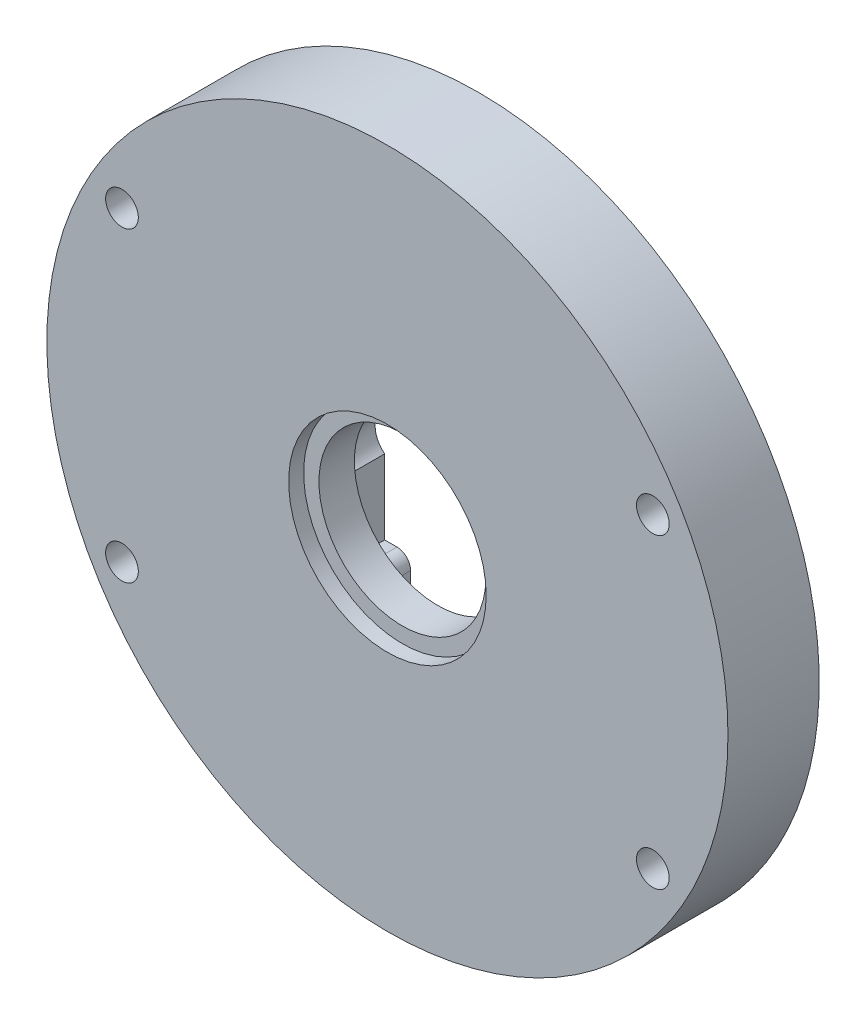
ISO-10303-21;
HEADER;
FILE_DESCRIPTION(('STEP AP214'),'2;1');
FILE_NAME('part.step','',(''),(''),'','','');
FILE_SCHEMA(('AUTOMOTIVE_DESIGN { 1 0 10303 214 1 1 1 1 }'));
ENDSEC;
DATA;
#1=APPLICATION_CONTEXT('core data for automotive mechanical design processes');
#2=APPLICATION_PROTOCOL_DEFINITION('international standard','automotive_design',2000,#1);
#3=PRODUCT_CONTEXT('',#1,'mechanical');
#4=PRODUCT('Part','Part','',(#3));
#5=PRODUCT_RELATED_PRODUCT_CATEGORY('part','',(#4));
#6=PRODUCT_DEFINITION_FORMATION('','',#4);
#7=PRODUCT_DEFINITION_CONTEXT('part definition',#1,'design');
#8=PRODUCT_DEFINITION('design','',#6,#7);
#9=PRODUCT_DEFINITION_SHAPE('','',#8);
#10=(LENGTH_UNIT() NAMED_UNIT(*) SI_UNIT(.MILLI.,.METRE.));
#11=(NAMED_UNIT(*) PLANE_ANGLE_UNIT() SI_UNIT($,.RADIAN.));
#12=(NAMED_UNIT(*) SI_UNIT($,.STERADIAN.) SOLID_ANGLE_UNIT());
#13=UNCERTAINTY_MEASURE_WITH_UNIT(LENGTH_MEASURE(1.E-05),#10,'distance_accuracy_value','');
#14=(GEOMETRIC_REPRESENTATION_CONTEXT(3) GLOBAL_UNCERTAINTY_ASSIGNED_CONTEXT((#13)) GLOBAL_UNIT_ASSIGNED_CONTEXT((#10,
#11,#12)) REPRESENTATION_CONTEXT('',''));
#15=CARTESIAN_POINT('',(0.,0.,0.));
#16=DIRECTION('',(0.,0.,1.));
#17=DIRECTION('',(1.,0.,0.));
#18=AXIS2_PLACEMENT_3D('',#15,#16,#17);
#19=CARTESIAN_POINT('',(0.,0.,5.6));
#20=DIRECTION('',(0.,0.,1.));
#21=DIRECTION('',(1.,0.,0.));
#22=AXIS2_PLACEMENT_3D('',#19,#20,#21);
#23=PLANE('',#22);
#24=CARTESIAN_POINT('',(0.,0.,5.6));
#25=DIRECTION('',(0.,0.,1.));
#26=DIRECTION('',(1.,0.,0.));
#27=AXIS2_PLACEMENT_3D('',#24,#25,#26);
#28=CIRCLE('',#27,6.125);
#29=CARTESIAN_POINT('',(6.125,0.,5.6));
#30=VERTEX_POINT('',#29);
#31=EDGE_CURVE('E339',#30,#30,#28,.T.);
#32=ORIENTED_EDGE('',*,*,#31,.F.);
#33=EDGE_LOOP('',(#32));
#34=FACE_BOUND('',#33,.T.);
#35=CARTESIAN_POINT('',(0.,0.,5.6));
#36=DIRECTION('',(0.,0.,1.));
#37=DIRECTION('',(1.,0.,0.));
#38=AXIS2_PLACEMENT_3D('',#35,#36,#37);
#39=CIRCLE('',#38,7.25);
#40=CARTESIAN_POINT('',(7.25,0.,5.6));
#41=VERTEX_POINT('',#40);
#42=EDGE_CURVE('E222',#41,#41,#39,.F.);
#43=ORIENTED_EDGE('',*,*,#42,.F.);
#44=EDGE_LOOP('',(#43));
#45=FACE_BOUND('',#44,.T.);
#46=ADVANCED_FACE('F37',(#34,#45),#23,.T.);
#47=CARTESIAN_POINT('',(6.90000000000001,-6.9,3.));
#48=DIRECTION('',(1.,0.,0.));
#49=DIRECTION('',(0.,1.,0.));
#50=AXIS2_PLACEMENT_3D('',#47,#48,#49);
#51=PLANE('',#50);
#52=DIRECTION('',(0.,-1.,0.));
#53=VECTOR('',#52,1.);
#54=CARTESIAN_POINT('',(6.90000000000001,-6.9,0.));
#55=LINE('',#54,#53);
#56=CARTESIAN_POINT('',(6.9,6.9,0.));
#57=VERTEX_POINT('',#56);
#58=CARTESIAN_POINT('',(6.9,1.4247806848775,0.));
#59=VERTEX_POINT('',#58);
#60=EDGE_CURVE('E145',#57,#59,#55,.T.);
#61=ORIENTED_EDGE('',*,*,#60,.T.);
#62=DIRECTION('',(0.,0.,1.));
#63=VECTOR('',#62,1.);
#64=CARTESIAN_POINT('',(6.9,1.4247806848775,0.));
#65=LINE('',#64,#63);
#66=CARTESIAN_POINT('',(6.9,1.4247806848775,3.));
#67=VERTEX_POINT('',#66);
#68=EDGE_CURVE('E137',#59,#67,#65,.T.);
#69=ORIENTED_EDGE('',*,*,#68,.T.);
#70=DIRECTION('',(0.,-1.,0.));
#71=VECTOR('',#70,1.);
#72=CARTESIAN_POINT('',(6.90000000000001,-6.9,3.));
#73=LINE('',#72,#71);
#74=CARTESIAN_POINT('',(6.9,6.9,3.));
#75=VERTEX_POINT('',#74);
#76=EDGE_CURVE('E142',#75,#67,#73,.T.);
#77=ORIENTED_EDGE('',*,*,#76,.F.);
#78=DIRECTION('',(0.,0.,-1.));
#79=VECTOR('',#78,1.);
#80=CARTESIAN_POINT('',(6.9,6.9,3.));
#81=LINE('',#80,#79);
#82=EDGE_CURVE('E183',#75,#57,#81,.T.);
#83=ORIENTED_EDGE('',*,*,#82,.T.);
#84=EDGE_LOOP('',(#61,#69,#77,#83));
#85=FACE_BOUND('',#84,.T.);
#86=ADVANCED_FACE('F139',(#85),#51,.F.);
#87=CARTESIAN_POINT('',(-6.9,-6.9,3.));
#88=DIRECTION('',(-1.,0.,0.));
#89=DIRECTION('',(0.,0.,1.));
#90=AXIS2_PLACEMENT_3D('',#87,#88,#89);
#91=PLANE('',#90);
#92=DIRECTION('',(0.,1.,0.));
#93=VECTOR('',#92,1.);
#94=CARTESIAN_POINT('',(-6.9,-6.9,0.));
#95=LINE('',#94,#93);
#96=CARTESIAN_POINT('',(-6.9,-6.9,0.));
#97=VERTEX_POINT('',#96);
#98=CARTESIAN_POINT('',(-6.9,-1.4247806848775,0.));
#99=VERTEX_POINT('',#98);
#100=EDGE_CURVE('E197',#97,#99,#95,.T.);
#101=ORIENTED_EDGE('',*,*,#100,.T.);
#102=DIRECTION('',(0.,0.,1.));
#103=VECTOR('',#102,1.);
#104=CARTESIAN_POINT('',(-6.9,-1.4247806848775,0.));
#105=LINE('',#104,#103);
#106=CARTESIAN_POINT('',(-6.9,-1.4247806848775,3.));
#107=VERTEX_POINT('',#106);
#108=EDGE_CURVE('E332',#99,#107,#105,.T.);
#109=ORIENTED_EDGE('',*,*,#108,.T.);
#110=DIRECTION('',(0.,1.,0.));
#111=VECTOR('',#110,1.);
#112=CARTESIAN_POINT('',(-6.9,-6.9,3.));
#113=LINE('',#112,#111);
#114=CARTESIAN_POINT('',(-6.9,-6.9,3.));
#115=VERTEX_POINT('',#114);
#116=EDGE_CURVE('E179',#115,#107,#113,.T.);
#117=ORIENTED_EDGE('',*,*,#116,.F.);
#118=DIRECTION('',(0.,0.,-1.));
#119=VECTOR('',#118,1.);
#120=CARTESIAN_POINT('',(-6.9,-6.9,3.));
#121=LINE('',#120,#119);
#122=EDGE_CURVE('E205',#115,#97,#121,.T.);
#123=ORIENTED_EDGE('',*,*,#122,.T.);
#124=EDGE_LOOP('',(#101,#109,#117,#123));
#125=FACE_BOUND('',#124,.T.);
#126=ADVANCED_FACE('F279',(#125),#91,.F.);
#127=CARTESIAN_POINT('',(6.90000000000001,-1.42478068487749,3.));
#128=VERTEX_POINT('',#127);
#129=CARTESIAN_POINT('',(6.90000000000001,-6.9,3.));
#130=VERTEX_POINT('',#129);
#131=EDGE_CURVE('E165',#128,#130,#73,.T.);
#132=ORIENTED_EDGE('',*,*,#131,.F.);
#133=DIRECTION('',(0.,0.,1.));
#134=VECTOR('',#133,1.);
#135=CARTESIAN_POINT('',(6.90000000000001,-1.42478068487749,0.));
#136=LINE('',#135,#134);
#137=CARTESIAN_POINT('',(6.90000000000001,-1.42478068487749,0.));
#138=VERTEX_POINT('',#137);
#139=EDGE_CURVE('E149',#128,#138,#136,.F.);
#140=ORIENTED_EDGE('',*,*,#139,.T.);
#141=CARTESIAN_POINT('',(6.90000000000001,-6.9,0.));
#142=VERTEX_POINT('',#141);
#143=EDGE_CURVE('E148',#138,#142,#55,.T.);
#144=ORIENTED_EDGE('',*,*,#143,.T.);
#145=DIRECTION('',(0.,0.,-1.));
#146=VECTOR('',#145,1.);
#147=CARTESIAN_POINT('',(6.90000000000001,-6.9,3.));
#148=LINE('',#147,#146);
#149=EDGE_CURVE('E214',#130,#142,#148,.T.);
#150=ORIENTED_EDGE('',*,*,#149,.F.);
#151=EDGE_LOOP('',(#132,#140,#144,#150));
#152=FACE_BOUND('',#151,.T.);
#153=ADVANCED_FACE('F281',(#152),#51,.F.);
#154=CARTESIAN_POINT('',(6.90000000000001,-6.9,3.));
#155=DIRECTION('',(0.,-1.,0.));
#156=DIRECTION('',(1.,0.,0.));
#157=AXIS2_PLACEMENT_3D('',#154,#155,#156);
#158=PLANE('',#157);
#159=DIRECTION('',(-1.,0.,0.));
#160=VECTOR('',#159,1.);
#161=CARTESIAN_POINT('',(6.90000000000001,-6.9,0.));
#162=LINE('',#161,#160);
#163=CARTESIAN_POINT('',(6.,-6.9,0.));
#164=VERTEX_POINT('',#163);
#165=EDGE_CURVE('E185',#142,#164,#162,.T.);
#166=ORIENTED_EDGE('',*,*,#165,.T.);
#167=DIRECTION('',(0.,0.,-1.));
#168=VECTOR('',#167,1.);
#169=CARTESIAN_POINT('',(6.,-6.9,3.));
#170=LINE('',#169,#168);
#171=CARTESIAN_POINT('',(6.,-6.9,3.));
#172=VERTEX_POINT('',#171);
#173=EDGE_CURVE('E52',#164,#172,#170,.F.);
#174=ORIENTED_EDGE('',*,*,#173,.T.);
#175=DIRECTION('',(-1.,0.,0.));
#176=VECTOR('',#175,1.);
#177=CARTESIAN_POINT('',(6.90000000000001,-6.9,3.));
#178=LINE('',#177,#176);
#179=EDGE_CURVE('E164',#130,#172,#178,.T.);
#180=ORIENTED_EDGE('',*,*,#179,.F.);
#181=ORIENTED_EDGE('',*,*,#149,.T.);
#182=EDGE_LOOP('',(#166,#174,#180,#181));
#183=FACE_BOUND('',#182,.T.);
#184=ADVANCED_FACE('F316',(#183),#158,.F.);
#185=CARTESIAN_POINT('',(5.,-6.9,3.));
#186=DIRECTION('',(1.,0.,0.));
#187=DIRECTION('',(0.,1.,0.));
#188=AXIS2_PLACEMENT_3D('',#185,#186,#187);
#189=PLANE('',#188);
#190=DIRECTION('',(0.,-1.,0.));
#191=VECTOR('',#190,1.);
#192=CARTESIAN_POINT('',(5.,-6.9,3.));
#193=LINE('',#192,#191);
#194=CARTESIAN_POINT('',(5.,-7.9,3.));
#195=VERTEX_POINT('',#194);
#196=CARTESIAN_POINT('',(5.,-24.4948974278318,3.));
#197=VERTEX_POINT('',#196);
#198=EDGE_CURVE('E167',#195,#197,#193,.T.);
#199=ORIENTED_EDGE('',*,*,#198,.F.);
#200=DIRECTION('',(0.,0.,-1.));
#201=VECTOR('',#200,1.);
#202=CARTESIAN_POINT('',(5.,-7.9,3.));
#203=LINE('',#202,#201);
#204=CARTESIAN_POINT('',(5.,-7.9,0.));
#205=VERTEX_POINT('',#204);
#206=EDGE_CURVE('E234',#195,#205,#203,.T.);
#207=ORIENTED_EDGE('',*,*,#206,.T.);
#208=DIRECTION('',(0.,-1.,0.));
#209=VECTOR('',#208,1.);
#210=CARTESIAN_POINT('',(5.,-6.9,0.));
#211=LINE('',#210,#209);
#212=CARTESIAN_POINT('',(5.,-24.4948974278318,0.));
#213=VERTEX_POINT('',#212);
#214=EDGE_CURVE('E187',#205,#213,#211,.T.);
#215=ORIENTED_EDGE('',*,*,#214,.T.);
#216=DIRECTION('',(0.,0.,-1.));
#217=VECTOR('',#216,1.);
#218=CARTESIAN_POINT('',(5.,-24.4948974278318,3.));
#219=LINE('',#218,#217);
#220=EDGE_CURVE('E211',#197,#213,#219,.T.);
#221=ORIENTED_EDGE('',*,*,#220,.F.);
#222=EDGE_LOOP('',(#199,#207,#215,#221));
#223=FACE_BOUND('',#222,.T.);
#224=ADVANCED_FACE('F265',(#223),#189,.F.);
#225=CARTESIAN_POINT('',(0.,0.,3.));
#226=DIRECTION('',(0.,0.,-1.));
#227=DIRECTION('',(-1.,0.,0.));
#228=AXIS2_PLACEMENT_3D('',#225,#226,#227);
#229=CYLINDRICAL_SURFACE('',#228,25.);
#230=CARTESIAN_POINT('',(0.,0.,0.));
#231=DIRECTION('',(0.,0.,1.));
#232=DIRECTION('',(1.,0.,0.));
#233=AXIS2_PLACEMENT_3D('',#230,#231,#232);
#234=CIRCLE('',#233,25.);
#235=CARTESIAN_POINT('',(-5.00000000000001,-24.4948974278318,0.));
#236=VERTEX_POINT('',#235);
#237=EDGE_CURVE('E189',#213,#236,#234,.T.);
#238=ORIENTED_EDGE('',*,*,#237,.T.);
#239=DIRECTION('',(0.,0.,-1.));
#240=VECTOR('',#239,1.);
#241=CARTESIAN_POINT('',(-5.00000000000001,-24.4948974278318,3.));
#242=LINE('',#241,#240);
#243=CARTESIAN_POINT('',(-5.00000000000001,-24.4948974278318,3.));
#244=VERTEX_POINT('',#243);
#245=EDGE_CURVE('E208',#244,#236,#242,.T.);
#246=ORIENTED_EDGE('',*,*,#245,.F.);
#247=CARTESIAN_POINT('',(0.,0.,3.));
#248=DIRECTION('',(0.,0.,1.));
#249=DIRECTION('',(1.,0.,0.));
#250=AXIS2_PLACEMENT_3D('',#247,#248,#249);
#251=CIRCLE('',#250,25.);
#252=EDGE_CURVE('E158',#244,#197,#251,.T.);
#253=ORIENTED_EDGE('',*,*,#252,.T.);
#254=ORIENTED_EDGE('',*,*,#220,.T.);
#255=EDGE_LOOP('',(#238,#246,#253,#254));
#256=FACE_BOUND('',#255,.T.);
#257=CARTESIAN_POINT('',(0.,0.,6.7));
#258=DIRECTION('',(0.,0.,1.));
#259=DIRECTION('',(1.,0.,0.));
#260=AXIS2_PLACEMENT_3D('',#257,#258,#259);
#261=CIRCLE('',#260,25.);
#262=CARTESIAN_POINT('',(25.,0.,6.7));
#263=VERTEX_POINT('',#262);
#264=EDGE_CURVE('E343',#263,#263,#261,.T.);
#265=ORIENTED_EDGE('',*,*,#264,.F.);
#266=EDGE_LOOP('',(#265));
#267=FACE_BOUND('',#266,.T.);
#268=ADVANCED_FACE('F259',(#256,#267),#229,.T.);
#269=CARTESIAN_POINT('',(-5.,-6.9,3.));
#270=DIRECTION('',(-1.,0.,0.));
#271=DIRECTION('',(0.,-1.,0.));
#272=AXIS2_PLACEMENT_3D('',#269,#270,#271);
#273=PLANE('',#272);
#274=DIRECTION('',(0.,1.,0.));
#275=VECTOR('',#274,1.);
#276=CARTESIAN_POINT('',(-5.,-6.9,0.));
#277=LINE('',#276,#275);
#278=CARTESIAN_POINT('',(-5.,-7.9,0.));
#279=VERTEX_POINT('',#278);
#280=EDGE_CURVE('E191',#236,#279,#277,.T.);
#281=ORIENTED_EDGE('',*,*,#280,.T.);
#282=DIRECTION('',(0.,0.,-1.));
#283=VECTOR('',#282,1.);
#284=CARTESIAN_POINT('',(-5.,-7.9,3.));
#285=LINE('',#284,#283);
#286=CARTESIAN_POINT('',(-5.,-7.9,3.));
#287=VERTEX_POINT('',#286);
#288=EDGE_CURVE('E232',#279,#287,#285,.F.);
#289=ORIENTED_EDGE('',*,*,#288,.T.);
#290=DIRECTION('',(0.,1.,0.));
#291=VECTOR('',#290,1.);
#292=CARTESIAN_POINT('',(-5.,-6.9,3.));
#293=LINE('',#292,#291);
#294=EDGE_CURVE('E173',#244,#287,#293,.T.);
#295=ORIENTED_EDGE('',*,*,#294,.F.);
#296=ORIENTED_EDGE('',*,*,#245,.T.);
#297=EDGE_LOOP('',(#281,#289,#295,#296));
#298=FACE_BOUND('',#297,.T.);
#299=ADVANCED_FACE('F256',(#298),#273,.F.);
#300=CARTESIAN_POINT('',(-5.,-6.9,3.));
#301=DIRECTION('',(0.,-1.,0.));
#302=DIRECTION('',(0.,0.,-1.));
#303=AXIS2_PLACEMENT_3D('',#300,#301,#302);
#304=PLANE('',#303);
#305=DIRECTION('',(-1.,0.,0.));
#306=VECTOR('',#305,1.);
#307=CARTESIAN_POINT('',(-5.,-6.9,3.));
#308=LINE('',#307,#306);
#309=CARTESIAN_POINT('',(-6.,-6.9,3.));
#310=VERTEX_POINT('',#309);
#311=EDGE_CURVE('E176',#310,#115,#308,.T.);
#312=ORIENTED_EDGE('',*,*,#311,.F.);
#313=DIRECTION('',(0.,0.,-1.));
#314=VECTOR('',#313,1.);
#315=CARTESIAN_POINT('',(-6.,-6.9,3.));
#316=LINE('',#315,#314);
#317=CARTESIAN_POINT('',(-6.,-6.9,0.));
#318=VERTEX_POINT('',#317);
#319=EDGE_CURVE('E225',#310,#318,#316,.T.);
#320=ORIENTED_EDGE('',*,*,#319,.T.);
#321=DIRECTION('',(-1.,0.,0.));
#322=VECTOR('',#321,1.);
#323=CARTESIAN_POINT('',(-5.,-6.9,0.));
#324=LINE('',#323,#322);
#325=EDGE_CURVE('E194',#318,#97,#324,.T.);
#326=ORIENTED_EDGE('',*,*,#325,.T.);
#327=ORIENTED_EDGE('',*,*,#122,.F.);
#328=EDGE_LOOP('',(#312,#320,#326,#327));
#329=FACE_BOUND('',#328,.T.);
#330=ADVANCED_FACE('F246',(#329),#304,.F.);
#331=CARTESIAN_POINT('',(-6.9,1.4247806848775,3.));
#332=VERTEX_POINT('',#331);
#333=CARTESIAN_POINT('',(-6.9,6.9,3.));
#334=VERTEX_POINT('',#333);
#335=EDGE_CURVE('E178',#332,#334,#113,.T.);
#336=ORIENTED_EDGE('',*,*,#335,.F.);
#337=DIRECTION('',(0.,0.,1.));
#338=VECTOR('',#337,1.);
#339=CARTESIAN_POINT('',(-6.9,1.4247806848775,0.));
#340=LINE('',#339,#338);
#341=CARTESIAN_POINT('',(-6.9,1.4247806848775,0.));
#342=VERTEX_POINT('',#341);
#343=EDGE_CURVE('E331',#332,#342,#340,.F.);
#344=ORIENTED_EDGE('',*,*,#343,.T.);
#345=CARTESIAN_POINT('',(-6.9,6.9,0.));
#346=VERTEX_POINT('',#345);
#347=EDGE_CURVE('E196',#342,#346,#95,.T.);
#348=ORIENTED_EDGE('',*,*,#347,.T.);
#349=DIRECTION('',(0.,0.,-1.));
#350=VECTOR('',#349,1.);
#351=CARTESIAN_POINT('',(-6.9,6.9,3.));
#352=LINE('',#351,#350);
#353=EDGE_CURVE('E202',#334,#346,#352,.T.);
#354=ORIENTED_EDGE('',*,*,#353,.F.);
#355=EDGE_LOOP('',(#336,#344,#348,#354));
#356=FACE_BOUND('',#355,.T.);
#357=ADVANCED_FACE('F303',(#356),#91,.F.);
#358=CARTESIAN_POINT('',(6.9,6.9,3.));
#359=DIRECTION('',(0.,1.,0.));
#360=DIRECTION('',(-1.,0.,0.));
#361=AXIS2_PLACEMENT_3D('',#358,#359,#360);
#362=PLANE('',#361);
#363=DIRECTION('',(1.,0.,0.));
#364=VECTOR('',#363,1.);
#365=CARTESIAN_POINT('',(6.9,6.9,0.));
#366=LINE('',#365,#364);
#367=EDGE_CURVE('E169',#346,#57,#366,.T.);
#368=ORIENTED_EDGE('',*,*,#367,.T.);
#369=ORIENTED_EDGE('',*,*,#82,.F.);
#370=DIRECTION('',(1.,0.,0.));
#371=VECTOR('',#370,1.);
#372=CARTESIAN_POINT('',(6.9,6.9,3.));
#373=LINE('',#372,#371);
#374=EDGE_CURVE('E163',#334,#75,#373,.T.);
#375=ORIENTED_EDGE('',*,*,#374,.F.);
#376=ORIENTED_EDGE('',*,*,#353,.T.);
#377=EDGE_LOOP('',(#368,#369,#375,#376));
#378=FACE_BOUND('',#377,.T.);
#379=ADVANCED_FACE('F299',(#378),#362,.F.);
#380=CARTESIAN_POINT('',(0.,0.,0.));
#381=DIRECTION('',(0.,0.,1.));
#382=DIRECTION('',(1.,0.,0.));
#383=AXIS2_PLACEMENT_3D('',#380,#381,#382);
#384=PLANE('',#383);
#385=CARTESIAN_POINT('',(19.4855715851499,11.25,0.));
#386=DIRECTION('',(0.,0.,1.));
#387=DIRECTION('',(1.,0.,0.));
#388=AXIS2_PLACEMENT_3D('',#385,#386,#387);
#389=CIRCLE('',#388,1.2);
#390=CARTESIAN_POINT('',(20.6855715851499,11.25,0.));
#391=VERTEX_POINT('',#390);
#392=EDGE_CURVE('E355',#391,#391,#389,.T.);
#393=ORIENTED_EDGE('',*,*,#392,.T.);
#394=EDGE_LOOP('',(#393));
#395=FACE_BOUND('',#394,.T.);
#396=CARTESIAN_POINT('',(-19.4855715851499,11.25,0.));
#397=DIRECTION('',(0.,0.,1.));
#398=DIRECTION('',(-1.,0.,0.));
#399=AXIS2_PLACEMENT_3D('',#396,#397,#398);
#400=CIRCLE('',#399,1.2);
#401=CARTESIAN_POINT('',(-20.6855715851499,11.25,0.));
#402=VERTEX_POINT('',#401);
#403=EDGE_CURVE('E367',#402,#402,#400,.T.);
#404=ORIENTED_EDGE('',*,*,#403,.T.);
#405=EDGE_LOOP('',(#404));
#406=FACE_BOUND('',#405,.T.);
#407=CARTESIAN_POINT('',(-19.4855715851499,-11.25,0.));
#408=DIRECTION('',(0.,0.,1.));
#409=DIRECTION('',(-1.,0.,0.));
#410=AXIS2_PLACEMENT_3D('',#407,#408,#409);
#411=CIRCLE('',#410,1.2);
#412=CARTESIAN_POINT('',(-20.6855715851499,-11.25,0.));
#413=VERTEX_POINT('',#412);
#414=EDGE_CURVE('E361',#413,#413,#411,.T.);
#415=ORIENTED_EDGE('',*,*,#414,.T.);
#416=EDGE_LOOP('',(#415));
#417=FACE_BOUND('',#416,.T.);
#418=CARTESIAN_POINT('',(19.4855715851499,-11.25,0.));
#419=DIRECTION('',(0.,0.,1.));
#420=DIRECTION('',(1.,0.,0.));
#421=AXIS2_PLACEMENT_3D('',#418,#419,#420);
#422=CIRCLE('',#421,1.2);
#423=CARTESIAN_POINT('',(20.6855715851499,-11.25,0.));
#424=VERTEX_POINT('',#423);
#425=EDGE_CURVE('E351',#424,#424,#422,.T.);
#426=ORIENTED_EDGE('',*,*,#425,.T.);
#427=EDGE_LOOP('',(#426));
#428=FACE_BOUND('',#427,.T.);
#429=ORIENTED_EDGE('',*,*,#325,.F.);
#430=CARTESIAN_POINT('',(-6.,-7.9,0.));
#431=DIRECTION('',(0.,0.,1.));
#432=DIRECTION('',(1.,0.,0.));
#433=AXIS2_PLACEMENT_3D('',#430,#431,#432);
#434=CIRCLE('',#433,1.);
#435=EDGE_CURVE('E230',#318,#279,#434,.F.);
#436=ORIENTED_EDGE('',*,*,#435,.T.);
#437=ORIENTED_EDGE('',*,*,#280,.F.);
#438=ORIENTED_EDGE('',*,*,#237,.F.);
#439=ORIENTED_EDGE('',*,*,#214,.F.);
#440=CARTESIAN_POINT('',(6.,-7.9,0.));
#441=DIRECTION('',(0.,0.,1.));
#442=DIRECTION('',(1.,0.,0.));
#443=AXIS2_PLACEMENT_3D('',#440,#441,#442);
#444=CIRCLE('',#443,1.);
#445=EDGE_CURVE('E228',#205,#164,#444,.F.);
#446=ORIENTED_EDGE('',*,*,#445,.T.);
#447=ORIENTED_EDGE('',*,*,#165,.F.);
#448=ORIENTED_EDGE('',*,*,#143,.F.);
#449=CARTESIAN_POINT('',(5.8,0.,0.));
#450=DIRECTION('',(0.,0.,1.));
#451=DIRECTION('',(1.,0.,0.));
#452=AXIS2_PLACEMENT_3D('',#449,#450,#451);
#453=CIRCLE('',#452,1.8);
#454=EDGE_CURVE('E220',#138,#59,#453,.T.);
#455=ORIENTED_EDGE('',*,*,#454,.T.);
#456=ORIENTED_EDGE('',*,*,#60,.F.);
#457=ORIENTED_EDGE('',*,*,#367,.F.);
#458=ORIENTED_EDGE('',*,*,#347,.F.);
#459=CARTESIAN_POINT('',(-5.8,0.,0.));
#460=DIRECTION('',(0.,0.,1.));
#461=DIRECTION('',(1.,0.,0.));
#462=AXIS2_PLACEMENT_3D('',#459,#460,#461);
#463=CIRCLE('',#462,1.8);
#464=EDGE_CURVE('E217',#342,#99,#463,.T.);
#465=ORIENTED_EDGE('',*,*,#464,.T.);
#466=ORIENTED_EDGE('',*,*,#100,.F.);
#467=EDGE_LOOP('',(#429,#436,#437,#438,#439,#446,#447,#448,#455,#456,#457,#458,#465,#466));
#468=FACE_BOUND('',#467,.T.);
#469=ADVANCED_FACE('F252',(#395,#406,#417,#428,#468),#384,.F.);
#470=CARTESIAN_POINT('',(-5.8,0.,0.));
#471=DIRECTION('',(0.,0.,1.));
#472=DIRECTION('',(1.,0.,0.));
#473=AXIS2_PLACEMENT_3D('',#470,#471,#472);
#474=CYLINDRICAL_SURFACE('',#473,1.8);
#475=ORIENTED_EDGE('',*,*,#464,.F.);
#476=ORIENTED_EDGE('',*,*,#343,.F.);
#477=CARTESIAN_POINT('',(-5.8,0.,3.));
#478=DIRECTION('',(0.,0.,1.));
#479=DIRECTION('',(1.,0.,0.));
#480=AXIS2_PLACEMENT_3D('',#477,#478,#479);
#481=CIRCLE('',#480,1.8);
#482=EDGE_CURVE('E157',#332,#107,#481,.T.);
#483=ORIENTED_EDGE('',*,*,#482,.T.);
#484=ORIENTED_EDGE('',*,*,#108,.F.);
#485=EDGE_LOOP('',(#475,#476,#483,#484));
#486=FACE_BOUND('',#485,.T.);
#487=ADVANCED_FACE('F291',(#486),#474,.F.);
#488=CARTESIAN_POINT('',(5.8,0.,0.));
#489=DIRECTION('',(0.,0.,1.));
#490=DIRECTION('',(1.,0.,0.));
#491=AXIS2_PLACEMENT_3D('',#488,#489,#490);
#492=CYLINDRICAL_SURFACE('',#491,1.8);
#493=ORIENTED_EDGE('',*,*,#454,.F.);
#494=ORIENTED_EDGE('',*,*,#139,.F.);
#495=CARTESIAN_POINT('',(5.8,0.,3.));
#496=DIRECTION('',(0.,0.,1.));
#497=DIRECTION('',(1.,0.,0.));
#498=AXIS2_PLACEMENT_3D('',#495,#496,#497);
#499=CIRCLE('',#498,1.8);
#500=EDGE_CURVE('E152',#128,#67,#499,.T.);
#501=ORIENTED_EDGE('',*,*,#500,.T.);
#502=ORIENTED_EDGE('',*,*,#68,.F.);
#503=EDGE_LOOP('',(#493,#494,#501,#502));
#504=FACE_BOUND('',#503,.T.);
#505=ADVANCED_FACE('F153',(#504),#492,.F.);
#506=CARTESIAN_POINT('',(0.,0.,3.));
#507=DIRECTION('',(0.,0.,1.));
#508=DIRECTION('',(1.,0.,0.));
#509=AXIS2_PLACEMENT_3D('',#506,#507,#508);
#510=PLANE('',#509);
#511=CARTESIAN_POINT('',(0.,0.,3.));
#512=DIRECTION('',(0.,0.,1.));
#513=DIRECTION('',(1.,0.,0.));
#514=AXIS2_PLACEMENT_3D('',#511,#512,#513);
#515=CIRCLE('',#514,6.125);
#516=CARTESIAN_POINT('',(6.125,0.,3.));
#517=VERTEX_POINT('',#516);
#518=EDGE_CURVE('E340',#517,#517,#515,.T.);
#519=ORIENTED_EDGE('',*,*,#518,.T.);
#520=EDGE_LOOP('',(#519));
#521=FACE_BOUND('',#520,.T.);
#522=ORIENTED_EDGE('',*,*,#179,.T.);
#523=CARTESIAN_POINT('',(6.,-7.9,3.));
#524=DIRECTION('',(0.,0.,1.));
#525=DIRECTION('',(1.,0.,0.));
#526=AXIS2_PLACEMENT_3D('',#523,#524,#525);
#527=CIRCLE('',#526,1.);
#528=EDGE_CURVE('E11',#172,#195,#527,.T.);
#529=ORIENTED_EDGE('',*,*,#528,.T.);
#530=ORIENTED_EDGE('',*,*,#198,.T.);
#531=ORIENTED_EDGE('',*,*,#252,.F.);
#532=ORIENTED_EDGE('',*,*,#294,.T.);
#533=CARTESIAN_POINT('',(-6.,-7.9,3.));
#534=DIRECTION('',(0.,0.,1.));
#535=DIRECTION('',(1.,0.,0.));
#536=AXIS2_PLACEMENT_3D('',#533,#534,#535);
#537=CIRCLE('',#536,1.);
#538=EDGE_CURVE('E45',#287,#310,#537,.T.);
#539=ORIENTED_EDGE('',*,*,#538,.T.);
#540=ORIENTED_EDGE('',*,*,#311,.T.);
#541=ORIENTED_EDGE('',*,*,#116,.T.);
#542=ORIENTED_EDGE('',*,*,#482,.F.);
#543=ORIENTED_EDGE('',*,*,#335,.T.);
#544=ORIENTED_EDGE('',*,*,#374,.T.);
#545=ORIENTED_EDGE('',*,*,#76,.T.);
#546=ORIENTED_EDGE('',*,*,#500,.F.);
#547=ORIENTED_EDGE('',*,*,#131,.T.);
#548=EDGE_LOOP('',(#522,#529,#530,#531,#532,#539,#540,#541,#542,#543,#544,#545,#546,#547));
#549=FACE_BOUND('',#548,.T.);
#550=ADVANCED_FACE('F160',(#521,#549),#510,.F.);
#551=CARTESIAN_POINT('',(0.,0.,5.6));
#552=DIRECTION('',(0.,0.,-1.));
#553=DIRECTION('',(-1.,0.,0.));
#554=AXIS2_PLACEMENT_3D('',#551,#552,#553);
#555=CYLINDRICAL_SURFACE('',#554,6.125);
#556=ORIENTED_EDGE('',*,*,#31,.T.);
#557=EDGE_LOOP('',(#556));
#558=FACE_BOUND('',#557,.T.);
#559=ORIENTED_EDGE('',*,*,#518,.F.);
#560=EDGE_LOOP('',(#559));
#561=FACE_BOUND('',#560,.T.);
#562=ADVANCED_FACE('F286',(#558,#561),#555,.F.);
#563=CARTESIAN_POINT('',(0.,0.,6.7));
#564=DIRECTION('',(0.,0.,1.));
#565=DIRECTION('',(1.,0.,0.));
#566=AXIS2_PLACEMENT_3D('',#563,#564,#565);
#567=PLANE('',#566);
#568=CARTESIAN_POINT('',(19.4855715851499,11.25,6.7));
#569=DIRECTION('',(0.,0.,1.));
#570=DIRECTION('',(1.,0.,0.));
#571=AXIS2_PLACEMENT_3D('',#568,#569,#570);
#572=CIRCLE('',#571,1.2);
#573=CARTESIAN_POINT('',(20.6855715851499,11.25,6.7));
#574=VERTEX_POINT('',#573);
#575=EDGE_CURVE('E370',#574,#574,#572,.T.);
#576=ORIENTED_EDGE('',*,*,#575,.F.);
#577=EDGE_LOOP('',(#576));
#578=FACE_BOUND('',#577,.T.);
#579=CARTESIAN_POINT('',(-19.4855715851499,11.25,6.7));
#580=DIRECTION('',(0.,0.,1.));
#581=DIRECTION('',(-1.,0.,0.));
#582=AXIS2_PLACEMENT_3D('',#579,#580,#581);
#583=CIRCLE('',#582,1.2);
#584=CARTESIAN_POINT('',(-20.6855715851499,11.25,6.7));
#585=VERTEX_POINT('',#584);
#586=EDGE_CURVE('E364',#585,#585,#583,.T.);
#587=ORIENTED_EDGE('',*,*,#586,.F.);
#588=EDGE_LOOP('',(#587));
#589=FACE_BOUND('',#588,.T.);
#590=CARTESIAN_POINT('',(-19.4855715851499,-11.25,6.7));
#591=DIRECTION('',(0.,0.,1.));
#592=DIRECTION('',(-1.,0.,0.));
#593=AXIS2_PLACEMENT_3D('',#590,#591,#592);
#594=CIRCLE('',#593,1.2);
#595=CARTESIAN_POINT('',(-20.6855715851499,-11.25,6.7));
#596=VERTEX_POINT('',#595);
#597=EDGE_CURVE('E358',#596,#596,#594,.T.);
#598=ORIENTED_EDGE('',*,*,#597,.F.);
#599=EDGE_LOOP('',(#598));
#600=FACE_BOUND('',#599,.T.);
#601=CARTESIAN_POINT('',(19.4855715851499,-11.25,6.7));
#602=DIRECTION('',(0.,0.,1.));
#603=DIRECTION('',(1.,0.,0.));
#604=AXIS2_PLACEMENT_3D('',#601,#602,#603);
#605=CIRCLE('',#604,1.2);
#606=CARTESIAN_POINT('',(20.6855715851499,-11.25,6.7));
#607=VERTEX_POINT('',#606);
#608=EDGE_CURVE('E352',#607,#607,#605,.T.);
#609=ORIENTED_EDGE('',*,*,#608,.F.);
#610=EDGE_LOOP('',(#609));
#611=FACE_BOUND('',#610,.T.);
#612=ORIENTED_EDGE('',*,*,#264,.T.);
#613=EDGE_LOOP('',(#612));
#614=FACE_BOUND('',#613,.T.);
#615=CARTESIAN_POINT('',(0.,0.,6.7));
#616=DIRECTION('',(0.,0.,1.));
#617=DIRECTION('',(1.,0.,0.));
#618=AXIS2_PLACEMENT_3D('',#615,#616,#617);
#619=CIRCLE('',#618,7.25);
#620=CARTESIAN_POINT('',(7.25,0.,6.7));
#621=VERTEX_POINT('',#620);
#622=EDGE_CURVE('E348',#621,#621,#619,.T.);
#623=ORIENTED_EDGE('',*,*,#622,.F.);
#624=EDGE_LOOP('',(#623));
#625=FACE_BOUND('',#624,.T.);
#626=ADVANCED_FACE('F383',(#578,#589,#600,#611,#614,#625),#567,.T.);
#627=CARTESIAN_POINT('',(0.,0.,6.7));
#628=DIRECTION('',(0.,0.,-1.));
#629=DIRECTION('',(-1.,0.,0.));
#630=AXIS2_PLACEMENT_3D('',#627,#628,#629);
#631=CYLINDRICAL_SURFACE('',#630,7.25);
#632=ORIENTED_EDGE('',*,*,#622,.T.);
#633=EDGE_LOOP('',(#632));
#634=FACE_BOUND('',#633,.T.);
#635=ORIENTED_EDGE('',*,*,#42,.T.);
#636=EDGE_LOOP('',(#635));
#637=FACE_BOUND('',#636,.T.);
#638=ADVANCED_FACE('F386',(#634,#637),#631,.F.);
#639=CARTESIAN_POINT('',(19.4855715851499,-11.25,0.));
#640=DIRECTION('',(0.,0.,1.));
#641=DIRECTION('',(1.,0.,0.));
#642=AXIS2_PLACEMENT_3D('',#639,#640,#641);
#643=CYLINDRICAL_SURFACE('',#642,1.2);
#644=ORIENTED_EDGE('',*,*,#425,.F.);
#645=EDGE_LOOP('',(#644));
#646=FACE_BOUND('',#645,.T.);
#647=ORIENTED_EDGE('',*,*,#608,.T.);
#648=EDGE_LOOP('',(#647));
#649=FACE_BOUND('',#648,.T.);
#650=ADVANCED_FACE('F399',(#646,#649),#643,.F.);
#651=CARTESIAN_POINT('',(-19.4855715851499,-11.25,0.));
#652=DIRECTION('',(0.,0.,1.));
#653=DIRECTION('',(1.,0.,0.));
#654=AXIS2_PLACEMENT_3D('',#651,#652,#653);
#655=CYLINDRICAL_SURFACE('',#654,1.2);
#656=ORIENTED_EDGE('',*,*,#414,.F.);
#657=EDGE_LOOP('',(#656));
#658=FACE_BOUND('',#657,.T.);
#659=ORIENTED_EDGE('',*,*,#597,.T.);
#660=EDGE_LOOP('',(#659));
#661=FACE_BOUND('',#660,.T.);
#662=ADVANCED_FACE('F405',(#658,#661),#655,.F.);
#663=CARTESIAN_POINT('',(-19.4855715851499,11.25,0.));
#664=DIRECTION('',(0.,0.,1.));
#665=DIRECTION('',(1.,0.,0.));
#666=AXIS2_PLACEMENT_3D('',#663,#664,#665);
#667=CYLINDRICAL_SURFACE('',#666,1.2);
#668=ORIENTED_EDGE('',*,*,#403,.F.);
#669=EDGE_LOOP('',(#668));
#670=FACE_BOUND('',#669,.T.);
#671=ORIENTED_EDGE('',*,*,#586,.T.);
#672=EDGE_LOOP('',(#671));
#673=FACE_BOUND('',#672,.T.);
#674=ADVANCED_FACE('F379',(#670,#673),#667,.F.);
#675=CARTESIAN_POINT('',(19.4855715851499,11.25,0.));
#676=DIRECTION('',(0.,0.,1.));
#677=DIRECTION('',(1.,0.,0.));
#678=AXIS2_PLACEMENT_3D('',#675,#676,#677);
#679=CYLINDRICAL_SURFACE('',#678,1.2);
#680=ORIENTED_EDGE('',*,*,#392,.F.);
#681=EDGE_LOOP('',(#680));
#682=FACE_BOUND('',#681,.T.);
#683=ORIENTED_EDGE('',*,*,#575,.T.);
#684=EDGE_LOOP('',(#683));
#685=FACE_BOUND('',#684,.T.);
#686=ADVANCED_FACE('F272',(#682,#685),#679,.F.);
#687=CARTESIAN_POINT('',(-6.,-7.9,3.));
#688=DIRECTION('',(0.,0.,-1.));
#689=DIRECTION('',(-1.,0.,0.));
#690=AXIS2_PLACEMENT_3D('',#687,#688,#689);
#691=CYLINDRICAL_SURFACE('',#690,1.);
#692=ORIENTED_EDGE('',*,*,#538,.F.);
#693=ORIENTED_EDGE('',*,*,#288,.F.);
#694=ORIENTED_EDGE('',*,*,#435,.F.);
#695=ORIENTED_EDGE('',*,*,#319,.F.);
#696=EDGE_LOOP('',(#692,#693,#694,#695));
#697=FACE_BOUND('',#696,.T.);
#698=ADVANCED_FACE('F249',(#697),#691,.T.);
#699=CARTESIAN_POINT('',(6.,-7.9,3.));
#700=DIRECTION('',(0.,0.,-1.));
#701=DIRECTION('',(-1.,0.,0.));
#702=AXIS2_PLACEMENT_3D('',#699,#700,#701);
#703=CYLINDRICAL_SURFACE('',#702,1.);
#704=ORIENTED_EDGE('',*,*,#528,.F.);
#705=ORIENTED_EDGE('',*,*,#173,.F.);
#706=ORIENTED_EDGE('',*,*,#445,.F.);
#707=ORIENTED_EDGE('',*,*,#206,.F.);
#708=EDGE_LOOP('',(#704,#705,#706,#707));
#709=FACE_BOUND('',#708,.T.);
#710=ADVANCED_FACE('F39',(#709),#703,.T.);
#711=CLOSED_SHELL('',(#46,#86,#126,#153,#184,#224,#268,#299,#330,#357,#379,#469,#487,#505,#550,
#562,#626,#638,#650,#662,#674,#686,#698,#710));
#712=MANIFOLD_SOLID_BREP('B2',#711);
#713=ADVANCED_BREP_SHAPE_REPRESENTATION('',(#18,#712),#14);
#714=SHAPE_DEFINITION_REPRESENTATION(#9,#713);
ENDSEC;
END-ISO-10303-21;
